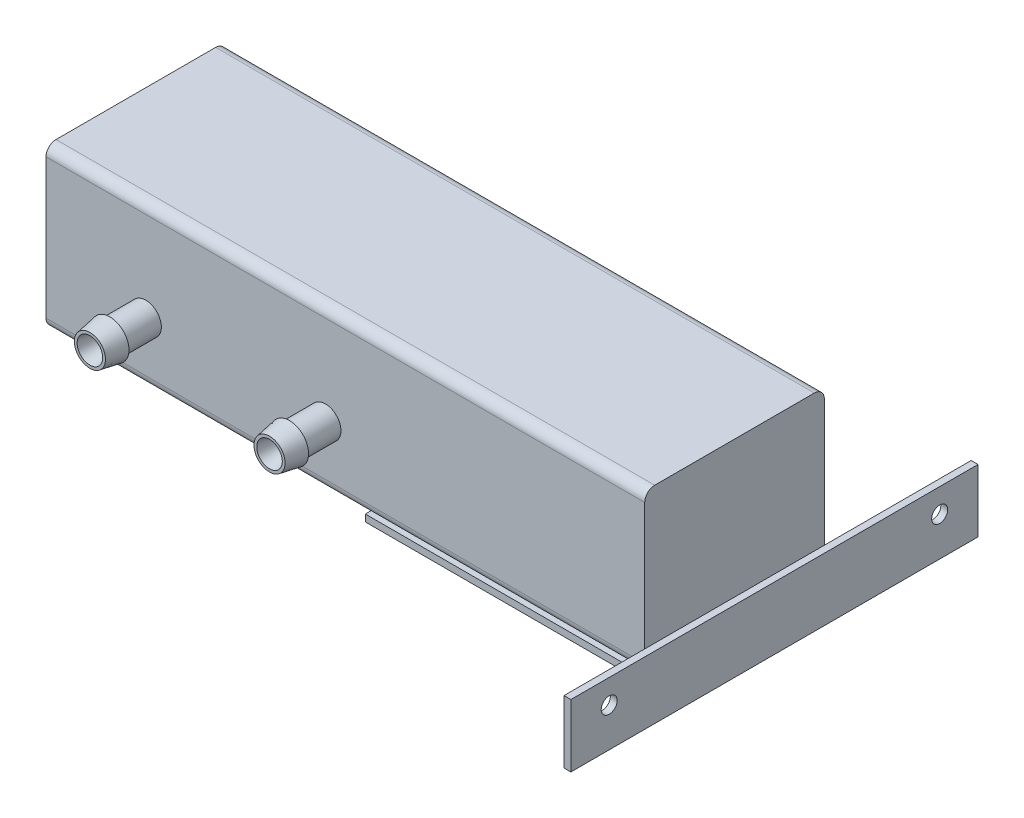
ISO-10303-21;
HEADER;
FILE_DESCRIPTION(('STEP AP214'),'2;1');
FILE_NAME('part.step','',(''),(''),'','','');
FILE_SCHEMA(('AUTOMOTIVE_DESIGN { 1 0 10303 214 1 1 1 1 }'));
ENDSEC;
DATA;
#1=APPLICATION_CONTEXT('core data for automotive mechanical design processes');
#2=APPLICATION_PROTOCOL_DEFINITION('international standard','automotive_design',2000,#1);
#3=PRODUCT_CONTEXT('',#1,'mechanical');
#4=PRODUCT('Part','Part','',(#3));
#5=PRODUCT_RELATED_PRODUCT_CATEGORY('part','',(#4));
#6=PRODUCT_DEFINITION_FORMATION('','',#4);
#7=PRODUCT_DEFINITION_CONTEXT('part definition',#1,'design');
#8=PRODUCT_DEFINITION('design','',#6,#7);
#9=PRODUCT_DEFINITION_SHAPE('','',#8);
#10=(LENGTH_UNIT() NAMED_UNIT(*) SI_UNIT(.MILLI.,.METRE.));
#11=(NAMED_UNIT(*) PLANE_ANGLE_UNIT() SI_UNIT($,.RADIAN.));
#12=(NAMED_UNIT(*) SI_UNIT($,.STERADIAN.) SOLID_ANGLE_UNIT());
#13=UNCERTAINTY_MEASURE_WITH_UNIT(LENGTH_MEASURE(1.E-05),#10,'distance_accuracy_value','');
#14=(GEOMETRIC_REPRESENTATION_CONTEXT(3) GLOBAL_UNCERTAINTY_ASSIGNED_CONTEXT((#13)) GLOBAL_UNIT_ASSIGNED_CONTEXT((#10,
#11,#12)) REPRESENTATION_CONTEXT('',''));
#15=CARTESIAN_POINT('',(0.,0.,0.));
#16=DIRECTION('',(0.,0.,1.));
#17=DIRECTION('',(1.,0.,0.));
#18=AXIS2_PLACEMENT_3D('',#15,#16,#17);
#19=CARTESIAN_POINT('',(0.,0.,28.575));
#20=DIRECTION('',(0.,0.,1.));
#21=DIRECTION('',(1.,0.,0.));
#22=AXIS2_PLACEMENT_3D('',#19,#20,#21);
#23=PLANE('',#22);
#24=DIRECTION('',(1.,0.,0.));
#25=VECTOR('',#24,1.);
#26=CARTESIAN_POINT('',(6.35000000000001,-27.5886003167765,28.575));
#27=LINE('',#26,#25);
#28=CARTESIAN_POINT('',(6.35000000000001,-27.5886003167765,28.575));
#29=VERTEX_POINT('',#28);
#30=CARTESIAN_POINT('',(105.761399683223,-27.5886003167765,28.575));
#31=VERTEX_POINT('',#30);
#32=EDGE_CURVE('E62',#29,#31,#27,.T.);
#33=ORIENTED_EDGE('',*,*,#32,.T.);
#34=DIRECTION('',(0.,1.,0.));
#35=VECTOR('',#34,1.);
#36=CARTESIAN_POINT('',(105.761399683223,0.,28.575));
#37=LINE('',#36,#35);
#38=CARTESIAN_POINT('',(105.761399683223,-25.4,28.575));
#39=VERTEX_POINT('',#38);
#40=EDGE_CURVE('E159',#31,#39,#37,.T.);
#41=ORIENTED_EDGE('',*,*,#40,.T.);
#42=DIRECTION('',(-1.,0.,0.));
#43=VECTOR('',#42,1.);
#44=CARTESIAN_POINT('',(6.35000000000001,-25.4,28.575));
#45=LINE('',#44,#43);
#46=CARTESIAN_POINT('',(6.35000000000001,-25.4,28.575));
#47=VERTEX_POINT('',#46);
#48=EDGE_CURVE('E168',#39,#47,#45,.T.);
#49=ORIENTED_EDGE('',*,*,#48,.T.);
#50=DIRECTION('',(0.,-1.,0.));
#51=VECTOR('',#50,1.);
#52=CARTESIAN_POINT('',(6.35000000000001,-25.4,28.575));
#53=LINE('',#52,#51);
#54=EDGE_CURVE('E161',#47,#29,#53,.T.);
#55=ORIENTED_EDGE('',*,*,#54,.T.);
#56=EDGE_LOOP('',(#33,#41,#49,#55));
#57=FACE_BOUND('',#56,.T.);
#58=ADVANCED_FACE('F47',(#57),#23,.T.);
#59=CARTESIAN_POINT('',(0.,0.,-28.575));
#60=DIRECTION('',(0.,0.,1.));
#61=DIRECTION('',(1.,0.,0.));
#62=AXIS2_PLACEMENT_3D('',#59,#60,#61);
#63=PLANE('',#62);
#64=DIRECTION('',(0.,1.,0.));
#65=VECTOR('',#64,1.);
#66=CARTESIAN_POINT('',(105.761399683223,0.,-28.575));
#67=LINE('',#66,#65);
#68=CARTESIAN_POINT('',(105.761399683223,-27.5886003167765,-28.575));
#69=VERTEX_POINT('',#68);
#70=CARTESIAN_POINT('',(105.761399683223,-25.4,-28.575));
#71=VERTEX_POINT('',#70);
#72=EDGE_CURVE('E12',#69,#71,#67,.T.);
#73=ORIENTED_EDGE('',*,*,#72,.F.);
#74=DIRECTION('',(-1.,0.,0.));
#75=VECTOR('',#74,1.);
#76=CARTESIAN_POINT('',(6.35000000000001,-27.5886003167765,-28.575));
#77=LINE('',#76,#75);
#78=CARTESIAN_POINT('',(6.35000000000001,-27.5886003167765,-28.575));
#79=VERTEX_POINT('',#78);
#80=EDGE_CURVE('E55',#69,#79,#77,.T.);
#81=ORIENTED_EDGE('',*,*,#80,.T.);
#82=DIRECTION('',(0.,1.,0.));
#83=VECTOR('',#82,1.);
#84=CARTESIAN_POINT('',(6.35000000000001,-25.4,-28.575));
#85=LINE('',#84,#83);
#86=CARTESIAN_POINT('',(6.35000000000001,-25.4,-28.575));
#87=VERTEX_POINT('',#86);
#88=EDGE_CURVE('E163',#79,#87,#85,.T.);
#89=ORIENTED_EDGE('',*,*,#88,.T.);
#90=DIRECTION('',(1.,0.,0.));
#91=VECTOR('',#90,1.);
#92=CARTESIAN_POINT('',(6.35000000000001,-25.4,-28.575));
#93=LINE('',#92,#91);
#94=EDGE_CURVE('E71',#87,#71,#93,.T.);
#95=ORIENTED_EDGE('',*,*,#94,.T.);
#96=EDGE_LOOP('',(#73,#81,#89,#95));
#97=FACE_BOUND('',#96,.T.);
#98=ADVANCED_FACE('F179',(#97),#63,.F.);
#99=CARTESIAN_POINT('',(6.35000000000001,-25.4,-132.118734714425));
#100=DIRECTION('',(-1.,0.,0.));
#101=DIRECTION('',(0.,0.,1.));
#102=AXIS2_PLACEMENT_3D('',#99,#100,#101);
#103=PLANE('',#102);
#104=ORIENTED_EDGE('',*,*,#88,.F.);
#105=DIRECTION('',(0.,0.,1.));
#106=VECTOR('',#105,1.);
#107=CARTESIAN_POINT('',(6.35000000000001,-27.5886003167765,-132.118734714425));
#108=LINE('',#107,#106);
#109=EDGE_CURVE('E171',#79,#29,#108,.T.);
#110=ORIENTED_EDGE('',*,*,#109,.T.);
#111=ORIENTED_EDGE('',*,*,#54,.F.);
#112=DIRECTION('',(0.,0.,1.));
#113=VECTOR('',#112,1.);
#114=CARTESIAN_POINT('',(6.35000000000001,-25.4,-132.118734714425));
#115=LINE('',#114,#113);
#116=EDGE_CURVE('E164',#87,#47,#115,.T.);
#117=ORIENTED_EDGE('',*,*,#116,.F.);
#118=EDGE_LOOP('',(#104,#110,#111,#117));
#119=FACE_BOUND('',#118,.T.);
#120=ADVANCED_FACE('F49',(#119),#103,.T.);
#121=CARTESIAN_POINT('',(6.35000000000001,-25.4,-132.118734714425));
#122=DIRECTION('',(0.,1.,0.));
#123=DIRECTION('',(0.,0.,1.));
#124=AXIS2_PLACEMENT_3D('',#121,#122,#123);
#125=PLANE('',#124);
#126=ORIENTED_EDGE('',*,*,#94,.F.);
#127=ORIENTED_EDGE('',*,*,#116,.T.);
#128=ORIENTED_EDGE('',*,*,#48,.F.);
#129=DIRECTION('',(0.,0.,1.));
#130=VECTOR('',#129,1.);
#131=CARTESIAN_POINT('',(105.761399683223,-25.4,-132.118734714425));
#132=LINE('',#131,#130);
#133=EDGE_CURVE('E173',#71,#39,#132,.T.);
#134=ORIENTED_EDGE('',*,*,#133,.F.);
#135=EDGE_LOOP('',(#126,#127,#128,#134));
#136=FACE_BOUND('',#135,.T.);
#137=ADVANCED_FACE('F190',(#136),#125,.T.);
#138=CARTESIAN_POINT('',(105.761399683223,-7.62000000000002,-132.118734714425));
#139=DIRECTION('',(-1.,0.,0.));
#140=DIRECTION('',(0.,0.,1.));
#141=AXIS2_PLACEMENT_3D('',#138,#139,#140);
#142=PLANE('',#141);
#143=CARTESIAN_POINT('',(105.761399683223,-15.24,52.578));
#144=DIRECTION('',(-1.,0.,0.));
#145=DIRECTION('',(0.,0.,1.));
#146=AXIS2_PLACEMENT_3D('',#143,#144,#145);
#147=CIRCLE('',#146,2.54);
#148=CARTESIAN_POINT('',(105.761399683223,-15.24,55.118));
#149=VERTEX_POINT('',#148);
#150=EDGE_CURVE('E230',#149,#149,#147,.T.);
#151=ORIENTED_EDGE('',*,*,#150,.F.);
#152=EDGE_LOOP('',(#151));
#153=FACE_BOUND('',#152,.T.);
#154=CARTESIAN_POINT('',(105.761399683223,-15.24,-52.578));
#155=DIRECTION('',(-1.,0.,0.));
#156=DIRECTION('',(0.,0.,1.));
#157=AXIS2_PLACEMENT_3D('',#154,#155,#156);
#158=CIRCLE('',#157,2.54);
#159=CARTESIAN_POINT('',(105.761399683223,-15.24,-50.038));
#160=VERTEX_POINT('',#159);
#161=EDGE_CURVE('E144',#160,#160,#158,.T.);
#162=ORIENTED_EDGE('',*,*,#161,.F.);
#163=EDGE_LOOP('',(#162));
#164=FACE_BOUND('',#163,.T.);
#165=DIRECTION('',(0.,0.,1.));
#166=VECTOR('',#165,1.);
#167=CARTESIAN_POINT('',(105.761399683223,-7.62000000000002,-132.118734714425));
#168=LINE('',#167,#166);
#169=CARTESIAN_POINT('',(105.761399683223,-7.62000000000002,-64.77));
#170=VERTEX_POINT('',#169);
#171=CARTESIAN_POINT('',(105.761399683223,-7.62000000000002,64.77));
#172=VERTEX_POINT('',#171);
#173=EDGE_CURVE('E124',#170,#172,#168,.T.);
#174=ORIENTED_EDGE('',*,*,#173,.F.);
#175=DIRECTION('',(0.,-1.,0.));
#176=VECTOR('',#175,1.);
#177=CARTESIAN_POINT('',(105.761399683223,-27.5886003167765,-64.77));
#178=LINE('',#177,#176);
#179=CARTESIAN_POINT('',(105.761399683223,-27.5886003167765,-64.77));
#180=VERTEX_POINT('',#179);
#181=EDGE_CURVE('E141',#170,#180,#178,.T.);
#182=ORIENTED_EDGE('',*,*,#181,.T.);
#183=DIRECTION('',(0.,0.,-1.));
#184=VECTOR('',#183,1.);
#185=CARTESIAN_POINT('',(105.761399683223,-27.5886003167765,64.77));
#186=LINE('',#185,#184);
#187=EDGE_CURVE('E149',#69,#180,#186,.T.);
#188=ORIENTED_EDGE('',*,*,#187,.F.);
#189=ORIENTED_EDGE('',*,*,#72,.T.);
#190=ORIENTED_EDGE('',*,*,#133,.T.);
#191=ORIENTED_EDGE('',*,*,#40,.F.);
#192=CARTESIAN_POINT('',(105.761399683223,-27.5886003167765,64.77));
#193=VERTEX_POINT('',#192);
#194=EDGE_CURVE('E156',#193,#31,#186,.T.);
#195=ORIENTED_EDGE('',*,*,#194,.F.);
#196=DIRECTION('',(0.,-1.,0.));
#197=VECTOR('',#196,1.);
#198=CARTESIAN_POINT('',(105.761399683223,-27.5886003167765,64.77));
#199=LINE('',#198,#197);
#200=EDGE_CURVE('E132',#172,#193,#199,.T.);
#201=ORIENTED_EDGE('',*,*,#200,.F.);
#202=EDGE_LOOP('',(#174,#182,#188,#189,#190,#191,#195,#201));
#203=FACE_BOUND('',#202,.T.);
#204=ADVANCED_FACE('F192',(#153,#164,#203),#142,.T.);
#205=CARTESIAN_POINT('',(107.95,-7.62000000000002,-132.118734714425));
#206=DIRECTION('',(0.,1.,0.));
#207=DIRECTION('',(0.,0.,1.));
#208=AXIS2_PLACEMENT_3D('',#205,#206,#207);
#209=PLANE('',#208);
#210=DIRECTION('',(0.,0.,1.));
#211=VECTOR('',#210,1.);
#212=CARTESIAN_POINT('',(107.95,-7.62000000000002,-132.118734714425));
#213=LINE('',#212,#211);
#214=CARTESIAN_POINT('',(107.95,-7.62000000000002,-64.77));
#215=VERTEX_POINT('',#214);
#216=CARTESIAN_POINT('',(107.95,-7.62000000000002,64.77));
#217=VERTEX_POINT('',#216);
#218=EDGE_CURVE('E114',#215,#217,#213,.T.);
#219=ORIENTED_EDGE('',*,*,#218,.F.);
#220=DIRECTION('',(-1.,0.,0.));
#221=VECTOR('',#220,1.);
#222=CARTESIAN_POINT('',(107.95,-7.62000000000002,-64.77));
#223=LINE('',#222,#221);
#224=EDGE_CURVE('E151',#215,#170,#223,.T.);
#225=ORIENTED_EDGE('',*,*,#224,.T.);
#226=ORIENTED_EDGE('',*,*,#173,.T.);
#227=DIRECTION('',(-1.,0.,0.));
#228=VECTOR('',#227,1.);
#229=CARTESIAN_POINT('',(107.95,-7.62000000000002,64.77));
#230=LINE('',#229,#228);
#231=EDGE_CURVE('E128',#217,#172,#230,.T.);
#232=ORIENTED_EDGE('',*,*,#231,.F.);
#233=EDGE_LOOP('',(#219,#225,#226,#232));
#234=FACE_BOUND('',#233,.T.);
#235=ADVANCED_FACE('F129',(#234),#209,.T.);
#236=CARTESIAN_POINT('',(107.95,-25.4,-132.118734714425));
#237=DIRECTION('',(1.,0.,0.));
#238=DIRECTION('',(0.,0.,-1.));
#239=AXIS2_PLACEMENT_3D('',#236,#237,#238);
#240=PLANE('',#239);
#241=CARTESIAN_POINT('',(107.95,-15.24,52.578));
#242=DIRECTION('',(-1.,0.,0.));
#243=DIRECTION('',(0.,0.,1.));
#244=AXIS2_PLACEMENT_3D('',#241,#242,#243);
#245=CIRCLE('',#244,2.54);
#246=CARTESIAN_POINT('',(107.95,-15.24,55.118));
#247=VERTEX_POINT('',#246);
#248=EDGE_CURVE('E152',#247,#247,#245,.T.);
#249=ORIENTED_EDGE('',*,*,#248,.T.);
#250=EDGE_LOOP('',(#249));
#251=FACE_BOUND('',#250,.T.);
#252=CARTESIAN_POINT('',(107.95,-15.24,-52.578));
#253=DIRECTION('',(-1.,0.,0.));
#254=DIRECTION('',(0.,0.,1.));
#255=AXIS2_PLACEMENT_3D('',#252,#253,#254);
#256=CIRCLE('',#255,2.54);
#257=CARTESIAN_POINT('',(107.95,-15.24,-50.038));
#258=VERTEX_POINT('',#257);
#259=EDGE_CURVE('E228',#258,#258,#256,.T.);
#260=ORIENTED_EDGE('',*,*,#259,.T.);
#261=EDGE_LOOP('',(#260));
#262=FACE_BOUND('',#261,.T.);
#263=DIRECTION('',(0.,0.,1.));
#264=VECTOR('',#263,1.);
#265=CARTESIAN_POINT('',(107.95,-27.5886003167765,-132.118734714425));
#266=LINE('',#265,#264);
#267=CARTESIAN_POINT('',(107.95,-27.5886003167765,-64.77));
#268=VERTEX_POINT('',#267);
#269=CARTESIAN_POINT('',(107.95,-27.5886003167765,64.77));
#270=VERTEX_POINT('',#269);
#271=EDGE_CURVE('E125',#268,#270,#266,.T.);
#272=ORIENTED_EDGE('',*,*,#271,.F.);
#273=DIRECTION('',(0.,1.,0.));
#274=VECTOR('',#273,1.);
#275=CARTESIAN_POINT('',(107.95,-27.5886003167765,-64.77));
#276=LINE('',#275,#274);
#277=EDGE_CURVE('E120',#268,#215,#276,.T.);
#278=ORIENTED_EDGE('',*,*,#277,.T.);
#279=ORIENTED_EDGE('',*,*,#218,.T.);
#280=DIRECTION('',(0.,1.,0.));
#281=VECTOR('',#280,1.);
#282=CARTESIAN_POINT('',(107.95,-27.5886003167765,64.77));
#283=LINE('',#282,#281);
#284=EDGE_CURVE('E118',#270,#217,#283,.T.);
#285=ORIENTED_EDGE('',*,*,#284,.F.);
#286=EDGE_LOOP('',(#272,#278,#279,#285));
#287=FACE_BOUND('',#286,.T.);
#288=ADVANCED_FACE('F116',(#251,#262,#287),#240,.T.);
#289=CARTESIAN_POINT('',(6.35000000000001,-27.5886003167765,-132.118734714425));
#290=DIRECTION('',(0.,-1.,0.));
#291=DIRECTION('',(0.,0.,-1.));
#292=AXIS2_PLACEMENT_3D('',#289,#290,#291);
#293=PLANE('',#292);
#294=ORIENTED_EDGE('',*,*,#194,.T.);
#295=ORIENTED_EDGE('',*,*,#32,.F.);
#296=ORIENTED_EDGE('',*,*,#109,.F.);
#297=ORIENTED_EDGE('',*,*,#80,.F.);
#298=ORIENTED_EDGE('',*,*,#187,.T.);
#299=DIRECTION('',(1.,0.,0.));
#300=VECTOR('',#299,1.);
#301=CARTESIAN_POINT('',(107.95,-27.5886003167765,-64.77));
#302=LINE('',#301,#300);
#303=EDGE_CURVE('E138',#180,#268,#302,.T.);
#304=ORIENTED_EDGE('',*,*,#303,.T.);
#305=ORIENTED_EDGE('',*,*,#271,.T.);
#306=DIRECTION('',(1.,0.,0.));
#307=VECTOR('',#306,1.);
#308=CARTESIAN_POINT('',(107.95,-27.5886003167765,64.77));
#309=LINE('',#308,#307);
#310=EDGE_CURVE('E137',#193,#270,#309,.T.);
#311=ORIENTED_EDGE('',*,*,#310,.F.);
#312=EDGE_LOOP('',(#294,#295,#296,#297,#298,#304,#305,#311));
#313=FACE_BOUND('',#312,.T.);
#314=ADVANCED_FACE('F186',(#313),#293,.T.);
#315=CARTESIAN_POINT('',(0.,0.,-64.77));
#316=DIRECTION('',(0.,0.,1.));
#317=DIRECTION('',(1.,0.,0.));
#318=AXIS2_PLACEMENT_3D('',#315,#316,#317);
#319=PLANE('',#318);
#320=ORIENTED_EDGE('',*,*,#277,.F.);
#321=ORIENTED_EDGE('',*,*,#303,.F.);
#322=ORIENTED_EDGE('',*,*,#181,.F.);
#323=ORIENTED_EDGE('',*,*,#224,.F.);
#324=EDGE_LOOP('',(#320,#321,#322,#323));
#325=FACE_BOUND('',#324,.T.);
#326=ADVANCED_FACE('F196',(#325),#319,.F.);
#327=CARTESIAN_POINT('',(0.,0.,64.77));
#328=DIRECTION('',(0.,0.,1.));
#329=DIRECTION('',(1.,0.,0.));
#330=AXIS2_PLACEMENT_3D('',#327,#328,#329);
#331=PLANE('',#330);
#332=ORIENTED_EDGE('',*,*,#284,.T.);
#333=ORIENTED_EDGE('',*,*,#231,.T.);
#334=ORIENTED_EDGE('',*,*,#200,.T.);
#335=ORIENTED_EDGE('',*,*,#310,.T.);
#336=EDGE_LOOP('',(#332,#333,#334,#335));
#337=FACE_BOUND('',#336,.T.);
#338=ADVANCED_FACE('F135',(#337),#331,.T.);
#339=CARTESIAN_POINT('',(107.95,-15.24,-52.578));
#340=DIRECTION('',(-1.,0.,0.));
#341=DIRECTION('',(0.,0.,1.));
#342=AXIS2_PLACEMENT_3D('',#339,#340,#341);
#343=CYLINDRICAL_SURFACE('',#342,2.54);
#344=ORIENTED_EDGE('',*,*,#259,.F.);
#345=EDGE_LOOP('',(#344));
#346=FACE_BOUND('',#345,.T.);
#347=ORIENTED_EDGE('',*,*,#161,.T.);
#348=EDGE_LOOP('',(#347));
#349=FACE_BOUND('',#348,.T.);
#350=ADVANCED_FACE('F203',(#346,#349),#343,.F.);
#351=CARTESIAN_POINT('',(107.95,-15.24,52.578));
#352=DIRECTION('',(-1.,0.,0.));
#353=DIRECTION('',(0.,0.,1.));
#354=AXIS2_PLACEMENT_3D('',#351,#352,#353);
#355=CYLINDRICAL_SURFACE('',#354,2.54);
#356=ORIENTED_EDGE('',*,*,#248,.F.);
#357=EDGE_LOOP('',(#356));
#358=FACE_BOUND('',#357,.T.);
#359=ORIENTED_EDGE('',*,*,#150,.T.);
#360=EDGE_LOOP('',(#359));
#361=FACE_BOUND('',#360,.T.);
#362=ADVANCED_FACE('F239',(#358,#361),#355,.F.);
#363=CLOSED_SHELL('',(#58,#98,#120,#137,#204,#235,#288,#314,#326,#338,#350,#362));
#364=MANIFOLD_SOLID_BREP('B2',#363);
#365=CARTESIAN_POINT('',(-6.34999999999999,-6.34999999999999,46.355));
#366=DIRECTION('',(0.,0.,-1.));
#367=DIRECTION('',(-1.,0.,0.));
#368=AXIS2_PLACEMENT_3D('',#365,#366,#367);
#369=CYLINDRICAL_SURFACE('',#368,4.95300000000002);
#370=CARTESIAN_POINT('',(-6.34999999999999,-6.34999999999999,28.575));
#371=DIRECTION('',(0.,0.,1.));
#372=DIRECTION('',(1.,0.,0.));
#373=AXIS2_PLACEMENT_3D('',#370,#371,#372);
#374=CIRCLE('',#373,4.95300000000002);
#375=CARTESIAN_POINT('',(-1.39699999999998,-6.34999999999999,28.575));
#376=VERTEX_POINT('',#375);
#377=EDGE_CURVE('E763',#376,#376,#374,.T.);
#378=ORIENTED_EDGE('',*,*,#377,.T.);
#379=EDGE_LOOP('',(#378));
#380=FACE_BOUND('',#379,.T.);
#381=CARTESIAN_POINT('',(-6.34999999999999,-6.34999999999999,40.005));
#382=DIRECTION('',(0.,0.,1.));
#383=DIRECTION('',(1.,0.,0.));
#384=AXIS2_PLACEMENT_3D('',#381,#382,#383);
#385=CIRCLE('',#384,4.95300000000002);
#386=CARTESIAN_POINT('',(-1.39699999999998,-6.34999999999999,40.005));
#387=VERTEX_POINT('',#386);
#388=EDGE_CURVE('E412',#387,#387,#385,.T.);
#389=ORIENTED_EDGE('',*,*,#388,.F.);
#390=EDGE_LOOP('',(#389));
#391=FACE_BOUND('',#390,.T.);
#392=ADVANCED_FACE('F331',(#380,#391),#369,.T.);
#393=CARTESIAN_POINT('',(-63.5,-6.34999999999999,46.355));
#394=DIRECTION('',(0.,0.,-1.));
#395=DIRECTION('',(-1.,0.,0.));
#396=AXIS2_PLACEMENT_3D('',#393,#394,#395);
#397=CYLINDRICAL_SURFACE('',#396,4.953);
#398=CARTESIAN_POINT('',(-63.5,-6.34999999999999,28.575));
#399=DIRECTION('',(0.,0.,1.));
#400=DIRECTION('',(1.,0.,0.));
#401=AXIS2_PLACEMENT_3D('',#398,#399,#400);
#402=CIRCLE('',#401,4.953);
#403=CARTESIAN_POINT('',(-58.547,-6.34999999999999,28.575));
#404=VERTEX_POINT('',#403);
#405=EDGE_CURVE('E426',#404,#404,#402,.T.);
#406=ORIENTED_EDGE('',*,*,#405,.T.);
#407=EDGE_LOOP('',(#406));
#408=FACE_BOUND('',#407,.T.);
#409=CARTESIAN_POINT('',(-63.5,-6.34999999999999,40.005));
#410=DIRECTION('',(0.,0.,1.));
#411=DIRECTION('',(1.,0.,0.));
#412=AXIS2_PLACEMENT_3D('',#409,#410,#411);
#413=CIRCLE('',#412,4.953);
#414=CARTESIAN_POINT('',(-58.547,-6.34999999999999,40.005));
#415=VERTEX_POINT('',#414);
#416=EDGE_CURVE('E447',#415,#415,#413,.T.);
#417=ORIENTED_EDGE('',*,*,#416,.F.);
#418=EDGE_LOOP('',(#417));
#419=FACE_BOUND('',#418,.T.);
#420=ADVANCED_FACE('F513',(#408,#419),#397,.T.);
#421=CARTESIAN_POINT('',(95.25,25.4,28.575));
#422=DIRECTION('',(-1.,0.,0.));
#423=DIRECTION('',(0.,-1.,0.));
#424=AXIS2_PLACEMENT_3D('',#421,#422,#423);
#425=PLANE('',#424);
#426=DIRECTION('',(0.,0.,-1.));
#427=VECTOR('',#426,1.);
#428=CARTESIAN_POINT('',(95.25,25.4,28.575));
#429=LINE('',#428,#427);
#430=CARTESIAN_POINT('',(95.25,25.4,25.4));
#431=VERTEX_POINT('',#430);
#432=CARTESIAN_POINT('',(95.25,25.4,-25.4));
#433=VERTEX_POINT('',#432);
#434=EDGE_CURVE('E438',#431,#433,#429,.T.);
#435=ORIENTED_EDGE('',*,*,#434,.F.);
#436=CARTESIAN_POINT('',(95.25,22.225,25.4));
#437=DIRECTION('',(-1.,0.,0.));
#438=DIRECTION('',(0.,-1.,0.));
#439=AXIS2_PLACEMENT_3D('',#436,#437,#438);
#440=CIRCLE('',#439,3.175);
#441=CARTESIAN_POINT('',(95.25,22.225,28.575));
#442=VERTEX_POINT('',#441);
#443=EDGE_CURVE('E417',#431,#442,#440,.F.);
#444=ORIENTED_EDGE('',*,*,#443,.T.);
#445=DIRECTION('',(0.,1.,0.));
#446=VECTOR('',#445,1.);
#447=CARTESIAN_POINT('',(95.25,25.4,28.575));
#448=LINE('',#447,#446);
#449=CARTESIAN_POINT('',(95.25,-22.225,28.575));
#450=VERTEX_POINT('',#449);
#451=EDGE_CURVE('E407',#450,#442,#448,.T.);
#452=ORIENTED_EDGE('',*,*,#451,.F.);
#453=CARTESIAN_POINT('',(95.25,-22.225,25.4));
#454=DIRECTION('',(-1.,0.,0.));
#455=DIRECTION('',(0.,-1.,0.));
#456=AXIS2_PLACEMENT_3D('',#453,#454,#455);
#457=CIRCLE('',#456,3.175);
#458=CARTESIAN_POINT('',(95.25,-25.4,25.4));
#459=VERTEX_POINT('',#458);
#460=EDGE_CURVE('E353',#450,#459,#457,.F.);
#461=ORIENTED_EDGE('',*,*,#460,.T.);
#462=DIRECTION('',(0.,0.,-1.));
#463=VECTOR('',#462,1.);
#464=CARTESIAN_POINT('',(95.25,-25.4,28.575));
#465=LINE('',#464,#463);
#466=CARTESIAN_POINT('',(95.25,-25.4,-25.4));
#467=VERTEX_POINT('',#466);
#468=EDGE_CURVE('E420',#459,#467,#465,.T.);
#469=ORIENTED_EDGE('',*,*,#468,.T.);
#470=CARTESIAN_POINT('',(95.25,-22.225,-25.4));
#471=DIRECTION('',(-1.,0.,0.));
#472=DIRECTION('',(0.,-1.,0.));
#473=AXIS2_PLACEMENT_3D('',#470,#471,#472);
#474=CIRCLE('',#473,3.175);
#475=CARTESIAN_POINT('',(95.25,-22.225,-28.575));
#476=VERTEX_POINT('',#475);
#477=EDGE_CURVE('E346',#467,#476,#474,.F.);
#478=ORIENTED_EDGE('',*,*,#477,.T.);
#479=DIRECTION('',(0.,1.,0.));
#480=VECTOR('',#479,1.);
#481=CARTESIAN_POINT('',(95.25,25.4,-28.575));
#482=LINE('',#481,#480);
#483=CARTESIAN_POINT('',(95.25,22.225,-28.575));
#484=VERTEX_POINT('',#483);
#485=EDGE_CURVE('E423',#476,#484,#482,.T.);
#486=ORIENTED_EDGE('',*,*,#485,.T.);
#487=CARTESIAN_POINT('',(95.25,22.225,-25.4));
#488=DIRECTION('',(-1.,0.,0.));
#489=DIRECTION('',(0.,-1.,0.));
#490=AXIS2_PLACEMENT_3D('',#487,#488,#489);
#491=CIRCLE('',#490,3.175);
#492=EDGE_CURVE('E472',#484,#433,#491,.F.);
#493=ORIENTED_EDGE('',*,*,#492,.T.);
#494=EDGE_LOOP('',(#435,#444,#452,#461,#469,#478,#486,#493));
#495=FACE_BOUND('',#494,.T.);
#496=ADVANCED_FACE('F415',(#495),#425,.F.);
#497=CARTESIAN_POINT('',(-95.25,25.4,28.575));
#498=DIRECTION('',(0.,-1.,0.));
#499=DIRECTION('',(0.,0.,-1.));
#500=AXIS2_PLACEMENT_3D('',#497,#498,#499);
#501=PLANE('',#500);
#502=DIRECTION('',(0.,0.,-1.));
#503=VECTOR('',#502,1.);
#504=CARTESIAN_POINT('',(-95.25,25.4,28.575));
#505=LINE('',#504,#503);
#506=CARTESIAN_POINT('',(-95.25,25.4,25.4));
#507=VERTEX_POINT('',#506);
#508=CARTESIAN_POINT('',(-95.25,25.4,-25.4));
#509=VERTEX_POINT('',#508);
#510=EDGE_CURVE('E435',#507,#509,#505,.T.);
#511=ORIENTED_EDGE('',*,*,#510,.F.);
#512=DIRECTION('',(-1.,0.,0.));
#513=VECTOR('',#512,1.);
#514=CARTESIAN_POINT('',(95.25,25.4,25.4));
#515=LINE('',#514,#513);
#516=EDGE_CURVE('E400',#507,#431,#515,.F.);
#517=ORIENTED_EDGE('',*,*,#516,.T.);
#518=ORIENTED_EDGE('',*,*,#434,.T.);
#519=DIRECTION('',(-1.,0.,0.));
#520=VECTOR('',#519,1.);
#521=CARTESIAN_POINT('',(-95.25,25.4,-25.4));
#522=LINE('',#521,#520);
#523=EDGE_CURVE('E467',#433,#509,#522,.T.);
#524=ORIENTED_EDGE('',*,*,#523,.T.);
#525=EDGE_LOOP('',(#511,#517,#518,#524));
#526=FACE_BOUND('',#525,.T.);
#527=ADVANCED_FACE('F496',(#526),#501,.F.);
#528=CARTESIAN_POINT('',(-95.25,25.4,28.575));
#529=DIRECTION('',(1.,0.,0.));
#530=DIRECTION('',(0.,0.,-1.));
#531=AXIS2_PLACEMENT_3D('',#528,#529,#530);
#532=PLANE('',#531);
#533=DIRECTION('',(0.,-1.,0.));
#534=VECTOR('',#533,1.);
#535=CARTESIAN_POINT('',(-95.25,25.4,28.575));
#536=LINE('',#535,#534);
#537=CARTESIAN_POINT('',(-95.25,22.225,28.575));
#538=VERTEX_POINT('',#537);
#539=CARTESIAN_POINT('',(-95.25,-22.225,28.575));
#540=VERTEX_POINT('',#539);
#541=EDGE_CURVE('E410',#538,#540,#536,.T.);
#542=ORIENTED_EDGE('',*,*,#541,.F.);
#543=CARTESIAN_POINT('',(-95.25,22.225,25.4));
#544=DIRECTION('',(1.,0.,0.));
#545=DIRECTION('',(0.,0.,-1.));
#546=AXIS2_PLACEMENT_3D('',#543,#544,#545);
#547=CIRCLE('',#546,3.175);
#548=EDGE_CURVE('E465',#538,#507,#547,.F.);
#549=ORIENTED_EDGE('',*,*,#548,.T.);
#550=ORIENTED_EDGE('',*,*,#510,.T.);
#551=CARTESIAN_POINT('',(-95.25,22.225,-25.4));
#552=DIRECTION('',(1.,0.,0.));
#553=DIRECTION('',(0.,0.,-1.));
#554=AXIS2_PLACEMENT_3D('',#551,#552,#553);
#555=CIRCLE('',#554,3.175);
#556=CARTESIAN_POINT('',(-95.25,22.225,-28.575));
#557=VERTEX_POINT('',#556);
#558=EDGE_CURVE('E463',#509,#557,#555,.F.);
#559=ORIENTED_EDGE('',*,*,#558,.T.);
#560=DIRECTION('',(0.,-1.,0.));
#561=VECTOR('',#560,1.);
#562=CARTESIAN_POINT('',(-95.25,25.4,-28.575));
#563=LINE('',#562,#561);
#564=CARTESIAN_POINT('',(-95.25,-22.225,-28.575));
#565=VERTEX_POINT('',#564);
#566=EDGE_CURVE('E418',#557,#565,#563,.T.);
#567=ORIENTED_EDGE('',*,*,#566,.T.);
#568=CARTESIAN_POINT('',(-95.25,-22.225,-25.4));
#569=DIRECTION('',(1.,0.,0.));
#570=DIRECTION('',(0.,0.,-1.));
#571=AXIS2_PLACEMENT_3D('',#568,#569,#570);
#572=CIRCLE('',#571,3.175);
#573=CARTESIAN_POINT('',(-95.25,-25.4,-25.4));
#574=VERTEX_POINT('',#573);
#575=EDGE_CURVE('E461',#565,#574,#572,.F.);
#576=ORIENTED_EDGE('',*,*,#575,.T.);
#577=DIRECTION('',(0.,0.,-1.));
#578=VECTOR('',#577,1.);
#579=CARTESIAN_POINT('',(-95.25,-25.4,28.575));
#580=LINE('',#579,#578);
#581=CARTESIAN_POINT('',(-95.25,-25.4,25.4));
#582=VERTEX_POINT('',#581);
#583=EDGE_CURVE('E432',#582,#574,#580,.T.);
#584=ORIENTED_EDGE('',*,*,#583,.F.);
#585=CARTESIAN_POINT('',(-95.25,-22.225,25.4));
#586=DIRECTION('',(1.,0.,0.));
#587=DIRECTION('',(0.,0.,-1.));
#588=AXIS2_PLACEMENT_3D('',#585,#586,#587);
#589=CIRCLE('',#588,3.175);
#590=EDGE_CURVE('E459',#582,#540,#589,.F.);
#591=ORIENTED_EDGE('',*,*,#590,.T.);
#592=EDGE_LOOP('',(#542,#549,#550,#559,#567,#576,#584,#591));
#593=FACE_BOUND('',#592,.T.);
#594=ADVANCED_FACE('F482',(#593),#532,.F.);
#595=CARTESIAN_POINT('',(-95.25,-25.4,28.575));
#596=DIRECTION('',(0.,1.,0.));
#597=DIRECTION('',(-1.,0.,0.));
#598=AXIS2_PLACEMENT_3D('',#595,#596,#597);
#599=PLANE('',#598);
#600=ORIENTED_EDGE('',*,*,#583,.T.);
#601=DIRECTION('',(1.,0.,0.));
#602=VECTOR('',#601,1.);
#603=CARTESIAN_POINT('',(-95.25,-25.4,-25.4));
#604=LINE('',#603,#602);
#605=EDGE_CURVE('E45',#574,#467,#604,.T.);
#606=ORIENTED_EDGE('',*,*,#605,.T.);
#607=ORIENTED_EDGE('',*,*,#468,.F.);
#608=DIRECTION('',(1.,0.,0.));
#609=VECTOR('',#608,1.);
#610=CARTESIAN_POINT('',(-95.25,-25.4,25.4));
#611=LINE('',#610,#609);
#612=EDGE_CURVE('E339',#459,#582,#611,.F.);
#613=ORIENTED_EDGE('',*,*,#612,.T.);
#614=EDGE_LOOP('',(#600,#606,#607,#613));
#615=FACE_BOUND('',#614,.T.);
#616=ADVANCED_FACE('F480',(#615),#599,.F.);
#617=CARTESIAN_POINT('',(0.,0.,28.575));
#618=DIRECTION('',(0.,0.,1.));
#619=DIRECTION('',(1.,0.,0.));
#620=AXIS2_PLACEMENT_3D('',#617,#618,#619);
#621=PLANE('',#620);
#622=ORIENTED_EDGE('',*,*,#377,.F.);
#623=EDGE_LOOP('',(#622));
#624=FACE_BOUND('',#623,.T.);
#625=ORIENTED_EDGE('',*,*,#405,.F.);
#626=EDGE_LOOP('',(#625));
#627=FACE_BOUND('',#626,.T.);
#628=ORIENTED_EDGE('',*,*,#451,.T.);
#629=DIRECTION('',(-1.,0.,0.));
#630=VECTOR('',#629,1.);
#631=CARTESIAN_POINT('',(-95.25,22.225,28.575));
#632=LINE('',#631,#630);
#633=EDGE_CURVE('E411',#442,#538,#632,.T.);
#634=ORIENTED_EDGE('',*,*,#633,.T.);
#635=ORIENTED_EDGE('',*,*,#541,.T.);
#636=DIRECTION('',(1.,0.,0.));
#637=VECTOR('',#636,1.);
#638=CARTESIAN_POINT('',(95.25,-22.225,28.575));
#639=LINE('',#638,#637);
#640=EDGE_CURVE('E399',#540,#450,#639,.T.);
#641=ORIENTED_EDGE('',*,*,#640,.T.);
#642=EDGE_LOOP('',(#628,#634,#635,#641));
#643=FACE_BOUND('',#642,.T.);
#644=ADVANCED_FACE('F405',(#624,#627,#643),#621,.T.);
#645=CARTESIAN_POINT('',(0.,0.,-28.575));
#646=DIRECTION('',(0.,0.,1.));
#647=DIRECTION('',(1.,0.,0.));
#648=AXIS2_PLACEMENT_3D('',#645,#646,#647);
#649=PLANE('',#648);
#650=ORIENTED_EDGE('',*,*,#566,.F.);
#651=DIRECTION('',(-1.,0.,0.));
#652=VECTOR('',#651,1.);
#653=CARTESIAN_POINT('',(0.,22.225,-28.575));
#654=LINE('',#653,#652);
#655=EDGE_CURVE('E477',#557,#484,#654,.F.);
#656=ORIENTED_EDGE('',*,*,#655,.T.);
#657=ORIENTED_EDGE('',*,*,#485,.F.);
#658=DIRECTION('',(1.,0.,0.));
#659=VECTOR('',#658,1.);
#660=CARTESIAN_POINT('',(0.,-22.225,-28.575));
#661=LINE('',#660,#659);
#662=EDGE_CURVE('E475',#476,#565,#661,.F.);
#663=ORIENTED_EDGE('',*,*,#662,.T.);
#664=EDGE_LOOP('',(#650,#656,#657,#663));
#665=FACE_BOUND('',#664,.T.);
#666=ADVANCED_FACE('F489',(#665),#649,.F.);
#667=CARTESIAN_POINT('',(-63.5,-6.34999999999999,46.355));
#668=DIRECTION('',(0.,0.,-1.));
#669=DIRECTION('',(1.,0.,0.));
#670=AXIS2_PLACEMENT_3D('',#667,#668,#669);
#671=CONICAL_SURFACE('',#670,4.953,0.174532925199433);
#672=CARTESIAN_POINT('',(-63.5,-6.34999999999999,40.005));
#673=DIRECTION('',(0.,0.,1.));
#674=DIRECTION('',(1.,0.,0.));
#675=AXIS2_PLACEMENT_3D('',#672,#673,#674);
#676=CIRCLE('',#675,6.07267632749875);
#677=CARTESIAN_POINT('',(-57.4273236725013,-6.34999999999999,40.005));
#678=VERTEX_POINT('',#677);
#679=EDGE_CURVE('E452',#678,#678,#676,.T.);
#680=ORIENTED_EDGE('',*,*,#679,.T.);
#681=EDGE_LOOP('',(#680));
#682=FACE_BOUND('',#681,.T.);
#683=CARTESIAN_POINT('',(-63.5,-6.34999999999999,46.355));
#684=DIRECTION('',(0.,0.,1.));
#685=DIRECTION('',(1.,0.,0.));
#686=AXIS2_PLACEMENT_3D('',#683,#684,#685);
#687=CIRCLE('',#686,4.953);
#688=CARTESIAN_POINT('',(-58.547,-6.34999999999999,46.355));
#689=VERTEX_POINT('',#688);
#690=EDGE_CURVE('E752',#689,#689,#687,.T.);
#691=ORIENTED_EDGE('',*,*,#690,.F.);
#692=EDGE_LOOP('',(#691));
#693=FACE_BOUND('',#692,.T.);
#694=ADVANCED_FACE('F543',(#682,#693),#671,.T.);
#695=CARTESIAN_POINT('',(-63.5,-6.34999999999999,40.005));
#696=DIRECTION('',(0.,0.,1.));
#697=DIRECTION('',(1.,0.,0.));
#698=AXIS2_PLACEMENT_3D('',#695,#696,#697);
#699=PLANE('',#698);
#700=ORIENTED_EDGE('',*,*,#416,.T.);
#701=EDGE_LOOP('',(#700));
#702=FACE_BOUND('',#701,.T.);
#703=ORIENTED_EDGE('',*,*,#679,.F.);
#704=EDGE_LOOP('',(#703));
#705=FACE_BOUND('',#704,.T.);
#706=ADVANCED_FACE('F535',(#702,#705),#699,.F.);
#707=CARTESIAN_POINT('',(-63.5,-6.34999999999999,46.355));
#708=DIRECTION('',(0.,0.,1.));
#709=DIRECTION('',(1.,0.,0.));
#710=AXIS2_PLACEMENT_3D('',#707,#708,#709);
#711=PLANE('',#710);
#712=ORIENTED_EDGE('',*,*,#690,.T.);
#713=EDGE_LOOP('',(#712));
#714=FACE_BOUND('',#713,.T.);
#715=CARTESIAN_POINT('',(-63.5,-6.34999999999999,46.355));
#716=DIRECTION('',(0.,0.,1.));
#717=DIRECTION('',(1.,0.,0.));
#718=AXIS2_PLACEMENT_3D('',#715,#716,#717);
#719=CIRCLE('',#718,4.06399999999999);
#720=CARTESIAN_POINT('',(-59.436,-6.34999999999999,46.355));
#721=VERTEX_POINT('',#720);
#722=EDGE_CURVE('E764',#721,#721,#719,.T.);
#723=ORIENTED_EDGE('',*,*,#722,.F.);
#724=EDGE_LOOP('',(#723));
#725=FACE_BOUND('',#724,.T.);
#726=ADVANCED_FACE('F532',(#714,#725),#711,.T.);
#727=CARTESIAN_POINT('',(-63.5,-6.34999999999999,46.355));
#728=DIRECTION('',(0.,0.,1.));
#729=DIRECTION('',(1.,0.,0.));
#730=AXIS2_PLACEMENT_3D('',#727,#728,#729);
#731=CONICAL_SURFACE('',#730,4.06399999999999,0.174532925199433);
#732=CARTESIAN_POINT('',(-63.5,-6.34999999999999,40.005));
#733=DIRECTION('',(0.,0.,1.));
#734=DIRECTION('',(1.,0.,0.));
#735=AXIS2_PLACEMENT_3D('',#732,#733,#734);
#736=CIRCLE('',#735,2.94432367250124);
#737=CARTESIAN_POINT('',(-60.5556763274988,-6.34999999999999,40.005));
#738=VERTEX_POINT('',#737);
#739=EDGE_CURVE('E455',#738,#738,#736,.T.);
#740=ORIENTED_EDGE('',*,*,#739,.F.);
#741=EDGE_LOOP('',(#740));
#742=FACE_BOUND('',#741,.T.);
#743=ORIENTED_EDGE('',*,*,#722,.T.);
#744=EDGE_LOOP('',(#743));
#745=FACE_BOUND('',#744,.T.);
#746=ADVANCED_FACE('F534',(#742,#745),#731,.F.);
#747=ORIENTED_EDGE('',*,*,#739,.T.);
#748=EDGE_LOOP('',(#747));
#749=FACE_BOUND('',#748,.T.);
#750=CARTESIAN_POINT('',(-63.5,-6.34999999999999,40.005));
#751=DIRECTION('',(0.,0.,1.));
#752=DIRECTION('',(1.,0.,0.));
#753=AXIS2_PLACEMENT_3D('',#750,#751,#752);
#754=CIRCLE('',#753,4.06399999999999);
#755=CARTESIAN_POINT('',(-59.436,-6.34999999999999,40.005));
#756=VERTEX_POINT('',#755);
#757=EDGE_CURVE('E448',#756,#756,#754,.T.);
#758=ORIENTED_EDGE('',*,*,#757,.F.);
#759=EDGE_LOOP('',(#758));
#760=FACE_BOUND('',#759,.T.);
#761=ADVANCED_FACE('F589',(#749,#760),#699,.F.);
#762=CARTESIAN_POINT('',(-63.5,-6.34999999999999,28.575));
#763=DIRECTION('',(0.,0.,1.));
#764=DIRECTION('',(1.,0.,0.));
#765=AXIS2_PLACEMENT_3D('',#762,#763,#764);
#766=CIRCLE('',#765,4.06399999999999);
#767=CARTESIAN_POINT('',(-59.436,-6.34999999999999,28.575));
#768=VERTEX_POINT('',#767);
#769=EDGE_CURVE('E441',#768,#768,#766,.F.);
#770=ORIENTED_EDGE('',*,*,#769,.F.);
#771=EDGE_LOOP('',(#770));
#772=FACE_BOUND('',#771,.T.);
#773=ADVANCED_FACE('F530',(#772),#621,.T.);
#774=CARTESIAN_POINT('',(-63.5,-6.34999999999999,46.355));
#775=DIRECTION('',(0.,0.,-1.));
#776=DIRECTION('',(-1.,0.,0.));
#777=AXIS2_PLACEMENT_3D('',#774,#775,#776);
#778=CYLINDRICAL_SURFACE('',#777,4.06399999999999);
#779=ORIENTED_EDGE('',*,*,#769,.T.);
#780=EDGE_LOOP('',(#779));
#781=FACE_BOUND('',#780,.T.);
#782=ORIENTED_EDGE('',*,*,#757,.T.);
#783=EDGE_LOOP('',(#782));
#784=FACE_BOUND('',#783,.T.);
#785=ADVANCED_FACE('F526',(#781,#784),#778,.F.);
#786=CARTESIAN_POINT('',(-6.34999999999999,-6.34999999999999,46.355));
#787=DIRECTION('',(0.,0.,-1.));
#788=DIRECTION('',(1.,0.,0.));
#789=AXIS2_PLACEMENT_3D('',#786,#787,#788);
#790=CONICAL_SURFACE('',#789,4.95300000000002,0.174532925199433);
#791=CARTESIAN_POINT('',(-6.34999999999999,-6.34999999999999,40.005));
#792=DIRECTION('',(0.,0.,1.));
#793=DIRECTION('',(1.,0.,0.));
#794=AXIS2_PLACEMENT_3D('',#791,#792,#793);
#795=CIRCLE('',#794,6.07267632749877);
#796=CARTESIAN_POINT('',(-0.277323672501223,-6.34999999999999,40.005));
#797=VERTEX_POINT('',#796);
#798=EDGE_CURVE('E456',#797,#797,#795,.T.);
#799=ORIENTED_EDGE('',*,*,#798,.T.);
#800=EDGE_LOOP('',(#799));
#801=FACE_BOUND('',#800,.T.);
#802=CARTESIAN_POINT('',(-6.34999999999999,-6.34999999999999,46.355));
#803=DIRECTION('',(0.,0.,1.));
#804=DIRECTION('',(1.,0.,0.));
#805=AXIS2_PLACEMENT_3D('',#802,#803,#804);
#806=CIRCLE('',#805,4.95300000000002);
#807=CARTESIAN_POINT('',(-1.39699999999998,-6.34999999999999,46.355));
#808=VERTEX_POINT('',#807);
#809=EDGE_CURVE('E743',#808,#808,#806,.T.);
#810=ORIENTED_EDGE('',*,*,#809,.F.);
#811=EDGE_LOOP('',(#810));
#812=FACE_BOUND('',#811,.T.);
#813=ADVANCED_FACE('F529',(#801,#812),#790,.T.);
#814=CARTESIAN_POINT('',(-6.34999999999999,-6.34999999999999,40.005));
#815=DIRECTION('',(0.,0.,1.));
#816=DIRECTION('',(1.,0.,0.));
#817=AXIS2_PLACEMENT_3D('',#814,#815,#816);
#818=PLANE('',#817);
#819=ORIENTED_EDGE('',*,*,#388,.T.);
#820=EDGE_LOOP('',(#819));
#821=FACE_BOUND('',#820,.T.);
#822=ORIENTED_EDGE('',*,*,#798,.F.);
#823=EDGE_LOOP('',(#822));
#824=FACE_BOUND('',#823,.T.);
#825=ADVANCED_FACE('F624',(#821,#824),#818,.F.);
#826=CARTESIAN_POINT('',(-6.34999999999999,-6.34999999999999,46.355));
#827=DIRECTION('',(0.,0.,1.));
#828=DIRECTION('',(1.,0.,0.));
#829=AXIS2_PLACEMENT_3D('',#826,#827,#828);
#830=PLANE('',#829);
#831=ORIENTED_EDGE('',*,*,#809,.T.);
#832=EDGE_LOOP('',(#831));
#833=FACE_BOUND('',#832,.T.);
#834=CARTESIAN_POINT('',(-6.34999999999999,-6.34999999999999,46.355));
#835=DIRECTION('',(0.,0.,1.));
#836=DIRECTION('',(1.,0.,0.));
#837=AXIS2_PLACEMENT_3D('',#834,#835,#836);
#838=CIRCLE('',#837,4.06400000000001);
#839=CARTESIAN_POINT('',(-2.28599999999998,-6.34999999999999,46.355));
#840=VERTEX_POINT('',#839);
#841=EDGE_CURVE('E451',#840,#840,#838,.T.);
#842=ORIENTED_EDGE('',*,*,#841,.F.);
#843=EDGE_LOOP('',(#842));
#844=FACE_BOUND('',#843,.T.);
#845=ADVANCED_FACE('F525',(#833,#844),#830,.T.);
#846=CARTESIAN_POINT('',(-6.34999999999999,-6.34999999999999,46.355));
#847=DIRECTION('',(0.,0.,1.));
#848=DIRECTION('',(1.,0.,0.));
#849=AXIS2_PLACEMENT_3D('',#846,#847,#848);
#850=CONICAL_SURFACE('',#849,4.06400000000001,0.174532925199433);
#851=CARTESIAN_POINT('',(-6.34999999999999,-6.34999999999999,40.005));
#852=DIRECTION('',(0.,0.,1.));
#853=DIRECTION('',(1.,0.,0.));
#854=AXIS2_PLACEMENT_3D('',#851,#852,#853);
#855=CIRCLE('',#854,2.94432367250125);
#856=CARTESIAN_POINT('',(-3.40567632749874,-6.34999999999999,40.005));
#857=VERTEX_POINT('',#856);
#858=EDGE_CURVE('E742',#857,#857,#855,.T.);
#859=ORIENTED_EDGE('',*,*,#858,.F.);
#860=EDGE_LOOP('',(#859));
#861=FACE_BOUND('',#860,.T.);
#862=ORIENTED_EDGE('',*,*,#841,.T.);
#863=EDGE_LOOP('',(#862));
#864=FACE_BOUND('',#863,.T.);
#865=ADVANCED_FACE('F640',(#861,#864),#850,.F.);
#866=ORIENTED_EDGE('',*,*,#858,.T.);
#867=EDGE_LOOP('',(#866));
#868=FACE_BOUND('',#867,.T.);
#869=CARTESIAN_POINT('',(-6.34999999999999,-6.34999999999999,40.005));
#870=DIRECTION('',(0.,0.,1.));
#871=DIRECTION('',(1.,0.,0.));
#872=AXIS2_PLACEMENT_3D('',#869,#870,#871);
#873=CIRCLE('',#872,4.06400000000001);
#874=CARTESIAN_POINT('',(-2.28599999999998,-6.34999999999999,40.005));
#875=VERTEX_POINT('',#874);
#876=EDGE_CURVE('E453',#875,#875,#873,.T.);
#877=ORIENTED_EDGE('',*,*,#876,.F.);
#878=EDGE_LOOP('',(#877));
#879=FACE_BOUND('',#878,.T.);
#880=ADVANCED_FACE('F634',(#868,#879),#818,.F.);
#881=CARTESIAN_POINT('',(-6.34999999999999,-6.34999999999999,28.575));
#882=DIRECTION('',(0.,0.,1.));
#883=DIRECTION('',(1.,0.,0.));
#884=AXIS2_PLACEMENT_3D('',#881,#882,#883);
#885=CIRCLE('',#884,4.06400000000001);
#886=CARTESIAN_POINT('',(-2.28599999999998,-6.34999999999999,28.575));
#887=VERTEX_POINT('',#886);
#888=EDGE_CURVE('E444',#887,#887,#885,.F.);
#889=ORIENTED_EDGE('',*,*,#888,.F.);
#890=EDGE_LOOP('',(#889));
#891=FACE_BOUND('',#890,.T.);
#892=ADVANCED_FACE('F508',(#891),#621,.T.);
#893=CARTESIAN_POINT('',(-6.34999999999999,-6.34999999999999,46.355));
#894=DIRECTION('',(0.,0.,-1.));
#895=DIRECTION('',(-1.,0.,0.));
#896=AXIS2_PLACEMENT_3D('',#893,#894,#895);
#897=CYLINDRICAL_SURFACE('',#896,4.06400000000001);
#898=ORIENTED_EDGE('',*,*,#888,.T.);
#899=EDGE_LOOP('',(#898));
#900=FACE_BOUND('',#899,.T.);
#901=ORIENTED_EDGE('',*,*,#876,.T.);
#902=EDGE_LOOP('',(#901));
#903=FACE_BOUND('',#902,.T.);
#904=ADVANCED_FACE('F501',(#900,#903),#897,.F.);
#905=CARTESIAN_POINT('',(0.,22.225,25.4));
#906=DIRECTION('',(1.,0.,0.));
#907=DIRECTION('',(0.,0.,-1.));
#908=AXIS2_PLACEMENT_3D('',#905,#906,#907);
#909=CYLINDRICAL_SURFACE('',#908,3.175);
#910=ORIENTED_EDGE('',*,*,#443,.F.);
#911=ORIENTED_EDGE('',*,*,#516,.F.);
#912=ORIENTED_EDGE('',*,*,#548,.F.);
#913=ORIENTED_EDGE('',*,*,#633,.F.);
#914=EDGE_LOOP('',(#910,#911,#912,#913));
#915=FACE_BOUND('',#914,.T.);
#916=ADVANCED_FACE('F499',(#915),#909,.T.);
#917=CARTESIAN_POINT('',(-95.25,22.225,-25.4));
#918=DIRECTION('',(-1.,0.,0.));
#919=DIRECTION('',(0.,0.,1.));
#920=AXIS2_PLACEMENT_3D('',#917,#918,#919);
#921=CYLINDRICAL_SURFACE('',#920,3.175);
#922=ORIENTED_EDGE('',*,*,#492,.F.);
#923=ORIENTED_EDGE('',*,*,#655,.F.);
#924=ORIENTED_EDGE('',*,*,#558,.F.);
#925=ORIENTED_EDGE('',*,*,#523,.F.);
#926=EDGE_LOOP('',(#922,#923,#924,#925));
#927=FACE_BOUND('',#926,.T.);
#928=ADVANCED_FACE('F492',(#927),#921,.T.);
#929=CARTESIAN_POINT('',(-95.25,-22.225,-25.4));
#930=DIRECTION('',(1.,0.,0.));
#931=DIRECTION('',(0.,1.,0.));
#932=AXIS2_PLACEMENT_3D('',#929,#930,#931);
#933=CYLINDRICAL_SURFACE('',#932,3.175);
#934=ORIENTED_EDGE('',*,*,#575,.F.);
#935=ORIENTED_EDGE('',*,*,#662,.F.);
#936=ORIENTED_EDGE('',*,*,#477,.F.);
#937=ORIENTED_EDGE('',*,*,#605,.F.);
#938=EDGE_LOOP('',(#934,#935,#936,#937));
#939=FACE_BOUND('',#938,.T.);
#940=ADVANCED_FACE('F485',(#939),#933,.T.);
#941=CARTESIAN_POINT('',(0.,-22.225,25.4));
#942=DIRECTION('',(-1.,0.,0.));
#943=DIRECTION('',(0.,-1.,0.));
#944=AXIS2_PLACEMENT_3D('',#941,#942,#943);
#945=CYLINDRICAL_SURFACE('',#944,3.175);
#946=ORIENTED_EDGE('',*,*,#590,.F.);
#947=ORIENTED_EDGE('',*,*,#612,.F.);
#948=ORIENTED_EDGE('',*,*,#460,.F.);
#949=ORIENTED_EDGE('',*,*,#640,.F.);
#950=EDGE_LOOP('',(#946,#947,#948,#949));
#951=FACE_BOUND('',#950,.T.);
#952=ADVANCED_FACE('F333',(#951),#945,.T.);
#953=CLOSED_SHELL('',(#392,#420,#496,#527,#594,#616,#644,#666,#694,#706,#726,#746,#761,#773,
#785,#813,#825,#845,#865,#880,#892,#904,#916,#928,#940,#952));
#954=MANIFOLD_SOLID_BREP('B6',#953);
#955=ADVANCED_BREP_SHAPE_REPRESENTATION('',(#18,#364,#954),#14);
#956=SHAPE_DEFINITION_REPRESENTATION(#9,#955);
ENDSEC;
END-ISO-10303-21;
